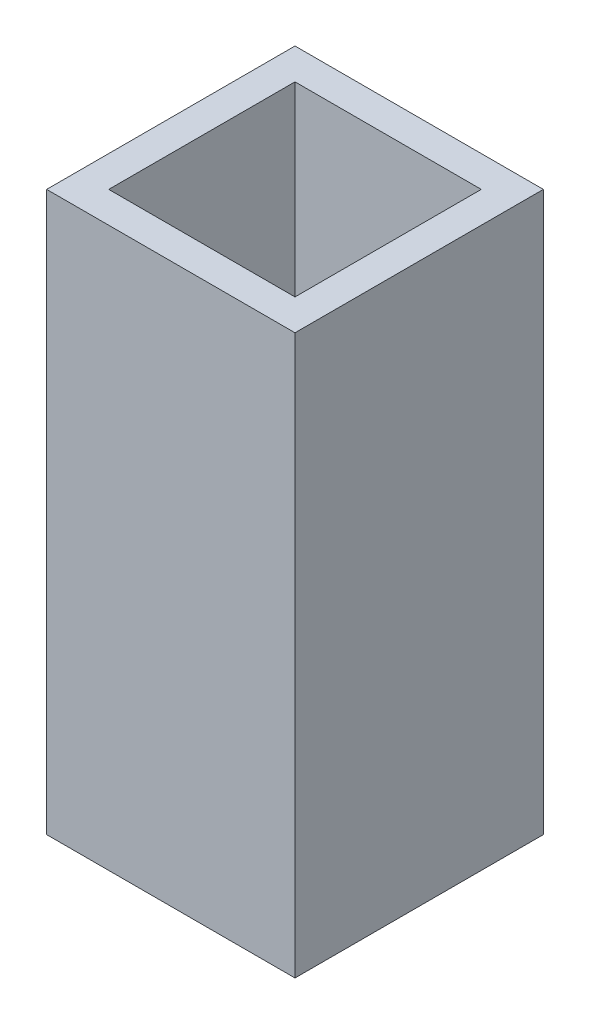
ISO-10303-21;
HEADER;
FILE_DESCRIPTION(('STEP AP214'),'2;1');
FILE_NAME('part.step','',(''),(''),'','','');
FILE_SCHEMA(('AUTOMOTIVE_DESIGN { 1 0 10303 214 1 1 1 1 }'));
ENDSEC;
DATA;
#1=APPLICATION_CONTEXT('core data for automotive mechanical design processes');
#2=APPLICATION_PROTOCOL_DEFINITION('international standard','automotive_design',2000,#1);
#3=PRODUCT_CONTEXT('',#1,'mechanical');
#4=PRODUCT('Part','Part','',(#3));
#5=PRODUCT_RELATED_PRODUCT_CATEGORY('part','',(#4));
#6=PRODUCT_DEFINITION_FORMATION('','',#4);
#7=PRODUCT_DEFINITION_CONTEXT('part definition',#1,'design');
#8=PRODUCT_DEFINITION('design','',#6,#7);
#9=PRODUCT_DEFINITION_SHAPE('','',#8);
#10=(LENGTH_UNIT() NAMED_UNIT(*) SI_UNIT(.MILLI.,.METRE.));
#11=(NAMED_UNIT(*) PLANE_ANGLE_UNIT() SI_UNIT($,.RADIAN.));
#12=(NAMED_UNIT(*) SI_UNIT($,.STERADIAN.) SOLID_ANGLE_UNIT());
#13=UNCERTAINTY_MEASURE_WITH_UNIT(LENGTH_MEASURE(1.E-05),#10,'distance_accuracy_value','');
#14=(GEOMETRIC_REPRESENTATION_CONTEXT(3) GLOBAL_UNCERTAINTY_ASSIGNED_CONTEXT((#13)) GLOBAL_UNIT_ASSIGNED_CONTEXT((#10,
#11,#12)) REPRESENTATION_CONTEXT('',''));
#15=CARTESIAN_POINT('',(0.,0.,0.));
#16=DIRECTION('',(0.,0.,1.));
#17=DIRECTION('',(1.,0.,0.));
#18=AXIS2_PLACEMENT_3D('',#15,#16,#17);
#19=CARTESIAN_POINT('',(0.,57.15,0.));
#20=DIRECTION('',(0.,1.,0.));
#21=DIRECTION('',(0.,0.,1.));
#22=AXIS2_PLACEMENT_3D('',#19,#20,#21);
#23=PLANE('',#22);
#24=DIRECTION('',(0.,0.,-1.));
#25=VECTOR('',#24,1.);
#26=CARTESIAN_POINT('',(12.7,57.15,12.7));
#27=LINE('',#26,#25);
#28=CARTESIAN_POINT('',(12.7,57.15,12.7));
#29=VERTEX_POINT('',#28);
#30=CARTESIAN_POINT('',(12.7,57.15,-12.7));
#31=VERTEX_POINT('',#30);
#32=EDGE_CURVE('E159',#29,#31,#27,.T.);
#33=ORIENTED_EDGE('',*,*,#32,.T.);
#34=DIRECTION('',(-1.,0.,0.));
#35=VECTOR('',#34,1.);
#36=CARTESIAN_POINT('',(-12.7,57.15,-12.7));
#37=LINE('',#36,#35);
#38=CARTESIAN_POINT('',(-12.7,57.15,-12.7));
#39=VERTEX_POINT('',#38);
#40=EDGE_CURVE('E162',#31,#39,#37,.T.);
#41=ORIENTED_EDGE('',*,*,#40,.T.);
#42=DIRECTION('',(0.,0.,1.));
#43=VECTOR('',#42,1.);
#44=CARTESIAN_POINT('',(-12.7,57.15,12.7));
#45=LINE('',#44,#43);
#46=CARTESIAN_POINT('',(-12.7,57.15,12.7));
#47=VERTEX_POINT('',#46);
#48=EDGE_CURVE('E165',#39,#47,#45,.T.);
#49=ORIENTED_EDGE('',*,*,#48,.T.);
#50=DIRECTION('',(1.,0.,0.));
#51=VECTOR('',#50,1.);
#52=CARTESIAN_POINT('',(-12.7,57.15,12.7));
#53=LINE('',#52,#51);
#54=EDGE_CURVE('E167',#47,#29,#53,.T.);
#55=ORIENTED_EDGE('',*,*,#54,.T.);
#56=EDGE_LOOP('',(#33,#41,#49,#55));
#57=FACE_BOUND('',#56,.T.);
#58=DIRECTION('',(-1.,0.,0.));
#59=VECTOR('',#58,1.);
#60=CARTESIAN_POINT('',(0.,57.15,-9.525));
#61=LINE('',#60,#59);
#62=CARTESIAN_POINT('',(9.52500000000001,57.15,-9.525));
#63=VERTEX_POINT('',#62);
#64=CARTESIAN_POINT('',(-9.525,57.15,-9.525));
#65=VERTEX_POINT('',#64);
#66=EDGE_CURVE('E131',#63,#65,#61,.T.);
#67=ORIENTED_EDGE('',*,*,#66,.F.);
#68=DIRECTION('',(0.,0.,-1.));
#69=VECTOR('',#68,1.);
#70=CARTESIAN_POINT('',(9.52500000000001,57.15,0.));
#71=LINE('',#70,#69);
#72=CARTESIAN_POINT('',(9.52500000000001,57.15,9.525));
#73=VERTEX_POINT('',#72);
#74=EDGE_CURVE('E123',#73,#63,#71,.T.);
#75=ORIENTED_EDGE('',*,*,#74,.F.);
#76=DIRECTION('',(1.,0.,0.));
#77=VECTOR('',#76,1.);
#78=CARTESIAN_POINT('',(0.,57.15,9.525));
#79=LINE('',#78,#77);
#80=CARTESIAN_POINT('',(-9.525,57.15,9.525));
#81=VERTEX_POINT('',#80);
#82=EDGE_CURVE('E145',#81,#73,#79,.T.);
#83=ORIENTED_EDGE('',*,*,#82,.F.);
#84=DIRECTION('',(0.,0.,1.));
#85=VECTOR('',#84,1.);
#86=CARTESIAN_POINT('',(-9.525,57.15,0.));
#87=LINE('',#86,#85);
#88=EDGE_CURVE('E143',#65,#81,#87,.T.);
#89=ORIENTED_EDGE('',*,*,#88,.F.);
#90=EDGE_LOOP('',(#67,#75,#83,#89));
#91=FACE_BOUND('',#90,.T.);
#92=ADVANCED_FACE('F58',(#57,#91),#23,.T.);
#93=CARTESIAN_POINT('',(0.,0.,0.));
#94=DIRECTION('',(0.,1.,0.));
#95=DIRECTION('',(0.,0.,1.));
#96=AXIS2_PLACEMENT_3D('',#93,#94,#95);
#97=PLANE('',#96);
#98=DIRECTION('',(0.,0.,-1.));
#99=VECTOR('',#98,1.);
#100=CARTESIAN_POINT('',(12.7,0.,12.7));
#101=LINE('',#100,#99);
#102=CARTESIAN_POINT('',(12.7,0.,12.7));
#103=VERTEX_POINT('',#102);
#104=CARTESIAN_POINT('',(12.7,0.,-12.7));
#105=VERTEX_POINT('',#104);
#106=EDGE_CURVE('E139',#103,#105,#101,.T.);
#107=ORIENTED_EDGE('',*,*,#106,.F.);
#108=DIRECTION('',(1.,0.,0.));
#109=VECTOR('',#108,1.);
#110=CARTESIAN_POINT('',(-12.7,0.,12.7));
#111=LINE('',#110,#109);
#112=CARTESIAN_POINT('',(-12.7,0.,12.7));
#113=VERTEX_POINT('',#112);
#114=EDGE_CURVE('E163',#113,#103,#111,.T.);
#115=ORIENTED_EDGE('',*,*,#114,.F.);
#116=DIRECTION('',(0.,0.,1.));
#117=VECTOR('',#116,1.);
#118=CARTESIAN_POINT('',(-12.7,0.,12.7));
#119=LINE('',#118,#117);
#120=CARTESIAN_POINT('',(-12.7,0.,-12.7));
#121=VERTEX_POINT('',#120);
#122=EDGE_CURVE('E174',#121,#113,#119,.T.);
#123=ORIENTED_EDGE('',*,*,#122,.F.);
#124=DIRECTION('',(-1.,0.,0.));
#125=VECTOR('',#124,1.);
#126=CARTESIAN_POINT('',(-12.7,0.,-12.7));
#127=LINE('',#126,#125);
#128=EDGE_CURVE('E172',#105,#121,#127,.T.);
#129=ORIENTED_EDGE('',*,*,#128,.F.);
#130=EDGE_LOOP('',(#107,#115,#123,#129));
#131=FACE_BOUND('',#130,.T.);
#132=DIRECTION('',(0.,0.,-1.));
#133=VECTOR('',#132,1.);
#134=CARTESIAN_POINT('',(9.52500000000001,0.,0.));
#135=LINE('',#134,#133);
#136=CARTESIAN_POINT('',(9.52500000000001,0.,9.525));
#137=VERTEX_POINT('',#136);
#138=CARTESIAN_POINT('',(9.52500000000001,0.,-9.525));
#139=VERTEX_POINT('',#138);
#140=EDGE_CURVE('E81',#137,#139,#135,.T.);
#141=ORIENTED_EDGE('',*,*,#140,.T.);
#142=DIRECTION('',(-1.,0.,0.));
#143=VECTOR('',#142,1.);
#144=CARTESIAN_POINT('',(0.,0.,-9.525));
#145=LINE('',#144,#143);
#146=CARTESIAN_POINT('',(-9.525,0.,-9.525));
#147=VERTEX_POINT('',#146);
#148=EDGE_CURVE('E138',#139,#147,#145,.T.);
#149=ORIENTED_EDGE('',*,*,#148,.T.);
#150=DIRECTION('',(0.,0.,1.));
#151=VECTOR('',#150,1.);
#152=CARTESIAN_POINT('',(-9.525,0.,0.));
#153=LINE('',#152,#151);
#154=CARTESIAN_POINT('',(-9.525,0.,9.525));
#155=VERTEX_POINT('',#154);
#156=EDGE_CURVE('E151',#147,#155,#153,.T.);
#157=ORIENTED_EDGE('',*,*,#156,.T.);
#158=DIRECTION('',(1.,0.,0.));
#159=VECTOR('',#158,1.);
#160=CARTESIAN_POINT('',(0.,0.,9.525));
#161=LINE('',#160,#159);
#162=EDGE_CURVE('E132',#155,#137,#161,.T.);
#163=ORIENTED_EDGE('',*,*,#162,.T.);
#164=EDGE_LOOP('',(#141,#149,#157,#163));
#165=FACE_BOUND('',#164,.T.);
#166=ADVANCED_FACE('F192',(#131,#165),#97,.F.);
#167=CARTESIAN_POINT('',(12.7,57.15,12.7));
#168=DIRECTION('',(-1.,0.,0.));
#169=DIRECTION('',(0.,0.,1.));
#170=AXIS2_PLACEMENT_3D('',#167,#168,#169);
#171=PLANE('',#170);
#172=ORIENTED_EDGE('',*,*,#106,.T.);
#173=DIRECTION('',(0.,-1.,0.));
#174=VECTOR('',#173,1.);
#175=CARTESIAN_POINT('',(12.7,57.15,-12.7));
#176=LINE('',#175,#174);
#177=EDGE_CURVE('E12',#31,#105,#176,.T.);
#178=ORIENTED_EDGE('',*,*,#177,.F.);
#179=ORIENTED_EDGE('',*,*,#32,.F.);
#180=DIRECTION('',(0.,-1.,0.));
#181=VECTOR('',#180,1.);
#182=CARTESIAN_POINT('',(12.7,57.15,12.7));
#183=LINE('',#182,#181);
#184=EDGE_CURVE('E169',#29,#103,#183,.T.);
#185=ORIENTED_EDGE('',*,*,#184,.T.);
#186=EDGE_LOOP('',(#172,#178,#179,#185));
#187=FACE_BOUND('',#186,.T.);
#188=ADVANCED_FACE('F60',(#187),#171,.F.);
#189=CARTESIAN_POINT('',(-12.7,57.15,-12.7));
#190=DIRECTION('',(0.,0.,1.));
#191=DIRECTION('',(1.,0.,0.));
#192=AXIS2_PLACEMENT_3D('',#189,#190,#191);
#193=PLANE('',#192);
#194=ORIENTED_EDGE('',*,*,#128,.T.);
#195=DIRECTION('',(0.,-1.,0.));
#196=VECTOR('',#195,1.);
#197=CARTESIAN_POINT('',(-12.7,57.15,-12.7));
#198=LINE('',#197,#196);
#199=EDGE_CURVE('E66',#39,#121,#198,.T.);
#200=ORIENTED_EDGE('',*,*,#199,.F.);
#201=ORIENTED_EDGE('',*,*,#40,.F.);
#202=ORIENTED_EDGE('',*,*,#177,.T.);
#203=EDGE_LOOP('',(#194,#200,#201,#202));
#204=FACE_BOUND('',#203,.T.);
#205=ADVANCED_FACE('F202',(#204),#193,.F.);
#206=CARTESIAN_POINT('',(-12.7,57.15,12.7));
#207=DIRECTION('',(1.,0.,0.));
#208=DIRECTION('',(0.,0.,-1.));
#209=AXIS2_PLACEMENT_3D('',#206,#207,#208);
#210=PLANE('',#209);
#211=ORIENTED_EDGE('',*,*,#122,.T.);
#212=DIRECTION('',(0.,-1.,0.));
#213=VECTOR('',#212,1.);
#214=CARTESIAN_POINT('',(-12.7,57.15,12.7));
#215=LINE('',#214,#213);
#216=EDGE_CURVE('E179',#47,#113,#215,.T.);
#217=ORIENTED_EDGE('',*,*,#216,.F.);
#218=ORIENTED_EDGE('',*,*,#48,.F.);
#219=ORIENTED_EDGE('',*,*,#199,.T.);
#220=EDGE_LOOP('',(#211,#217,#218,#219));
#221=FACE_BOUND('',#220,.T.);
#222=ADVANCED_FACE('F186',(#221),#210,.F.);
#223=CARTESIAN_POINT('',(-12.7,57.15,12.7));
#224=DIRECTION('',(0.,0.,-1.));
#225=DIRECTION('',(-1.,0.,0.));
#226=AXIS2_PLACEMENT_3D('',#223,#224,#225);
#227=PLANE('',#226);
#228=ORIENTED_EDGE('',*,*,#114,.T.);
#229=ORIENTED_EDGE('',*,*,#184,.F.);
#230=ORIENTED_EDGE('',*,*,#54,.F.);
#231=ORIENTED_EDGE('',*,*,#216,.T.);
#232=EDGE_LOOP('',(#228,#229,#230,#231));
#233=FACE_BOUND('',#232,.T.);
#234=ADVANCED_FACE('F196',(#233),#227,.F.);
#235=CARTESIAN_POINT('',(9.52500000000001,57.15,0.));
#236=DIRECTION('',(-1.,0.,0.));
#237=DIRECTION('',(0.,0.,1.));
#238=AXIS2_PLACEMENT_3D('',#235,#236,#237);
#239=PLANE('',#238);
#240=ORIENTED_EDGE('',*,*,#140,.F.);
#241=DIRECTION('',(0.,-1.,0.));
#242=VECTOR('',#241,1.);
#243=CARTESIAN_POINT('',(9.52500000000001,57.15,9.525));
#244=LINE('',#243,#242);
#245=EDGE_CURVE('E127',#73,#137,#244,.T.);
#246=ORIENTED_EDGE('',*,*,#245,.F.);
#247=ORIENTED_EDGE('',*,*,#74,.T.);
#248=DIRECTION('',(0.,-1.,0.));
#249=VECTOR('',#248,1.);
#250=CARTESIAN_POINT('',(9.52500000000001,57.15,-9.525));
#251=LINE('',#250,#249);
#252=EDGE_CURVE('E126',#63,#139,#251,.T.);
#253=ORIENTED_EDGE('',*,*,#252,.T.);
#254=EDGE_LOOP('',(#240,#246,#247,#253));
#255=FACE_BOUND('',#254,.T.);
#256=ADVANCED_FACE('F125',(#255),#239,.T.);
#257=CARTESIAN_POINT('',(0.,57.15,-9.525));
#258=DIRECTION('',(0.,0.,1.));
#259=DIRECTION('',(1.,0.,0.));
#260=AXIS2_PLACEMENT_3D('',#257,#258,#259);
#261=PLANE('',#260);
#262=ORIENTED_EDGE('',*,*,#148,.F.);
#263=ORIENTED_EDGE('',*,*,#252,.F.);
#264=ORIENTED_EDGE('',*,*,#66,.T.);
#265=DIRECTION('',(0.,-1.,0.));
#266=VECTOR('',#265,1.);
#267=CARTESIAN_POINT('',(-9.525,57.15,-9.525));
#268=LINE('',#267,#266);
#269=EDGE_CURVE('E140',#65,#147,#268,.T.);
#270=ORIENTED_EDGE('',*,*,#269,.T.);
#271=EDGE_LOOP('',(#262,#263,#264,#270));
#272=FACE_BOUND('',#271,.T.);
#273=ADVANCED_FACE('F135',(#272),#261,.T.);
#274=CARTESIAN_POINT('',(-9.525,57.15,0.));
#275=DIRECTION('',(1.,0.,0.));
#276=DIRECTION('',(0.,0.,-1.));
#277=AXIS2_PLACEMENT_3D('',#274,#275,#276);
#278=PLANE('',#277);
#279=ORIENTED_EDGE('',*,*,#156,.F.);
#280=ORIENTED_EDGE('',*,*,#269,.F.);
#281=ORIENTED_EDGE('',*,*,#88,.T.);
#282=DIRECTION('',(0.,-1.,0.));
#283=VECTOR('',#282,1.);
#284=CARTESIAN_POINT('',(-9.525,57.15,9.525));
#285=LINE('',#284,#283);
#286=EDGE_CURVE('E73',#81,#155,#285,.T.);
#287=ORIENTED_EDGE('',*,*,#286,.T.);
#288=EDGE_LOOP('',(#279,#280,#281,#287));
#289=FACE_BOUND('',#288,.T.);
#290=ADVANCED_FACE('F225',(#289),#278,.T.);
#291=CARTESIAN_POINT('',(0.,57.15,9.525));
#292=DIRECTION('',(0.,0.,-1.));
#293=DIRECTION('',(-1.,0.,0.));
#294=AXIS2_PLACEMENT_3D('',#291,#292,#293);
#295=PLANE('',#294);
#296=ORIENTED_EDGE('',*,*,#162,.F.);
#297=ORIENTED_EDGE('',*,*,#286,.F.);
#298=ORIENTED_EDGE('',*,*,#82,.T.);
#299=ORIENTED_EDGE('',*,*,#245,.T.);
#300=EDGE_LOOP('',(#296,#297,#298,#299));
#301=FACE_BOUND('',#300,.T.);
#302=ADVANCED_FACE('F229',(#301),#295,.T.);
#303=CLOSED_SHELL('',(#92,#166,#188,#205,#222,#234,#256,#273,#290,#302));
#304=MANIFOLD_SOLID_BREP('B2',#303);
#305=ADVANCED_BREP_SHAPE_REPRESENTATION('',(#18,#304),#14);
#306=SHAPE_DEFINITION_REPRESENTATION(#9,#305);
ENDSEC;
END-ISO-10303-21;
